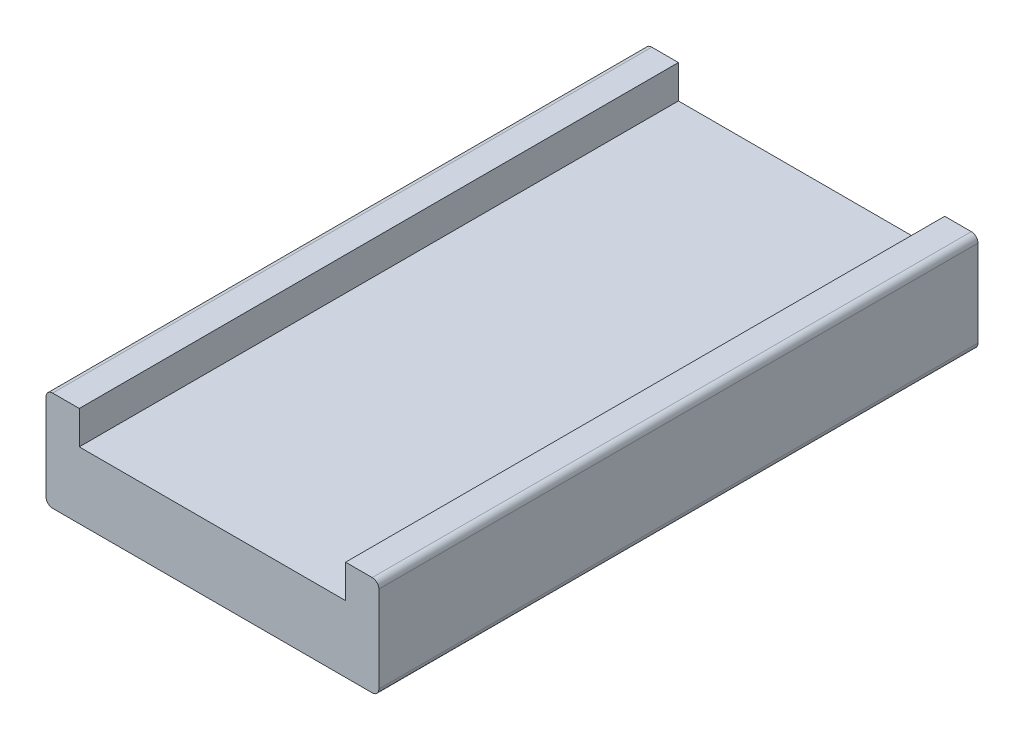
ISO-10303-21;
HEADER;
FILE_DESCRIPTION(('STEP AP214'),'2;1');
FILE_NAME('part.step','',(''),(''),'','','');
FILE_SCHEMA(('AUTOMOTIVE_DESIGN { 1 0 10303 214 1 1 1 1 }'));
ENDSEC;
DATA;
#1=APPLICATION_CONTEXT('core data for automotive mechanical design processes');
#2=APPLICATION_PROTOCOL_DEFINITION('international standard','automotive_design',2000,#1);
#3=PRODUCT_CONTEXT('',#1,'mechanical');
#4=PRODUCT('Part','Part','',(#3));
#5=PRODUCT_RELATED_PRODUCT_CATEGORY('part','',(#4));
#6=PRODUCT_DEFINITION_FORMATION('','',#4);
#7=PRODUCT_DEFINITION_CONTEXT('part definition',#1,'design');
#8=PRODUCT_DEFINITION('design','',#6,#7);
#9=PRODUCT_DEFINITION_SHAPE('','',#8);
#10=(LENGTH_UNIT() NAMED_UNIT(*) SI_UNIT(.MILLI.,.METRE.));
#11=(NAMED_UNIT(*) PLANE_ANGLE_UNIT() SI_UNIT($,.RADIAN.));
#12=(NAMED_UNIT(*) SI_UNIT($,.STERADIAN.) SOLID_ANGLE_UNIT());
#13=UNCERTAINTY_MEASURE_WITH_UNIT(LENGTH_MEASURE(1.E-05),#10,'distance_accuracy_value','');
#14=(GEOMETRIC_REPRESENTATION_CONTEXT(3) GLOBAL_UNCERTAINTY_ASSIGNED_CONTEXT((#13)) GLOBAL_UNIT_ASSIGNED_CONTEXT((#10,
#11,#12)) REPRESENTATION_CONTEXT('',''));
#15=CARTESIAN_POINT('',(0.,0.,0.));
#16=DIRECTION('',(0.,0.,1.));
#17=DIRECTION('',(1.,0.,0.));
#18=AXIS2_PLACEMENT_3D('',#15,#16,#17);
#19=CARTESIAN_POINT('',(-25.,15.,90.));
#20=DIRECTION('',(1.,0.,0.));
#21=DIRECTION('',(0.,1.,0.));
#22=AXIS2_PLACEMENT_3D('',#19,#20,#21);
#23=PLANE('',#22);
#24=DIRECTION('',(0.,-1.,0.));
#25=VECTOR('',#24,1.);
#26=CARTESIAN_POINT('',(-25.,15.,90.));
#27=LINE('',#26,#25);
#28=CARTESIAN_POINT('',(-25.,14.,90.));
#29=VERTEX_POINT('',#28);
#30=CARTESIAN_POINT('',(-25.,0.999999999999999,90.));
#31=VERTEX_POINT('',#30);
#32=EDGE_CURVE('E178',#29,#31,#27,.T.);
#33=ORIENTED_EDGE('',*,*,#32,.F.);
#34=DIRECTION('',(0.,0.,-1.));
#35=VECTOR('',#34,1.);
#36=CARTESIAN_POINT('',(-25.,14.,90.));
#37=LINE('',#36,#35);
#38=CARTESIAN_POINT('',(-25.,14.,0.));
#39=VERTEX_POINT('',#38);
#40=EDGE_CURVE('E208',#29,#39,#37,.T.);
#41=ORIENTED_EDGE('',*,*,#40,.T.);
#42=DIRECTION('',(0.,-1.,0.));
#43=VECTOR('',#42,1.);
#44=CARTESIAN_POINT('',(-25.,15.,0.));
#45=LINE('',#44,#43);
#46=CARTESIAN_POINT('',(-25.,0.999999999999999,0.));
#47=VERTEX_POINT('',#46);
#48=EDGE_CURVE('E161',#39,#47,#45,.T.);
#49=ORIENTED_EDGE('',*,*,#48,.T.);
#50=DIRECTION('',(0.,0.,-1.));
#51=VECTOR('',#50,1.);
#52=CARTESIAN_POINT('',(-25.,0.999999999999999,90.));
#53=LINE('',#52,#51);
#54=EDGE_CURVE('E206',#47,#31,#53,.F.);
#55=ORIENTED_EDGE('',*,*,#54,.T.);
#56=EDGE_LOOP('',(#33,#41,#49,#55));
#57=FACE_BOUND('',#56,.T.);
#58=ADVANCED_FACE('F33',(#57),#23,.F.);
#59=CARTESIAN_POINT('',(-25.,0.,90.));
#60=DIRECTION('',(0.,1.,0.));
#61=DIRECTION('',(-1.,0.,0.));
#62=AXIS2_PLACEMENT_3D('',#59,#60,#61);
#63=PLANE('',#62);
#64=DIRECTION('',(1.,0.,0.));
#65=VECTOR('',#64,1.);
#66=CARTESIAN_POINT('',(-25.,0.,90.));
#67=LINE('',#66,#65);
#68=CARTESIAN_POINT('',(-24.,0.,90.));
#69=VERTEX_POINT('',#68);
#70=CARTESIAN_POINT('',(24.,0.,90.));
#71=VERTEX_POINT('',#70);
#72=EDGE_CURVE('E228',#69,#71,#67,.T.);
#73=ORIENTED_EDGE('',*,*,#72,.F.);
#74=DIRECTION('',(0.,0.,-1.));
#75=VECTOR('',#74,1.);
#76=CARTESIAN_POINT('',(-24.,0.,90.));
#77=LINE('',#76,#75);
#78=CARTESIAN_POINT('',(-24.,0.,0.));
#79=VERTEX_POINT('',#78);
#80=EDGE_CURVE('E11',#69,#79,#77,.T.);
#81=ORIENTED_EDGE('',*,*,#80,.T.);
#82=DIRECTION('',(1.,0.,0.));
#83=VECTOR('',#82,1.);
#84=CARTESIAN_POINT('',(-25.,0.,0.));
#85=LINE('',#84,#83);
#86=CARTESIAN_POINT('',(24.,0.,0.));
#87=VERTEX_POINT('',#86);
#88=EDGE_CURVE('E164',#79,#87,#85,.T.);
#89=ORIENTED_EDGE('',*,*,#88,.T.);
#90=DIRECTION('',(0.,0.,-1.));
#91=VECTOR('',#90,1.);
#92=CARTESIAN_POINT('',(24.,0.,90.));
#93=LINE('',#92,#91);
#94=EDGE_CURVE('E41',#87,#71,#93,.F.);
#95=ORIENTED_EDGE('',*,*,#94,.T.);
#96=EDGE_LOOP('',(#73,#81,#89,#95));
#97=FACE_BOUND('',#96,.T.);
#98=ADVANCED_FACE('F227',(#97),#63,.F.);
#99=CARTESIAN_POINT('',(25.,0.,90.));
#100=DIRECTION('',(-1.,0.,0.));
#101=DIRECTION('',(0.,0.,1.));
#102=AXIS2_PLACEMENT_3D('',#99,#100,#101);
#103=PLANE('',#102);
#104=DIRECTION('',(0.,1.,0.));
#105=VECTOR('',#104,1.);
#106=CARTESIAN_POINT('',(25.,0.,0.));
#107=LINE('',#106,#105);
#108=CARTESIAN_POINT('',(25.,1.00000000000001,0.));
#109=VERTEX_POINT('',#108);
#110=CARTESIAN_POINT('',(25.,14.,0.));
#111=VERTEX_POINT('',#110);
#112=EDGE_CURVE('E166',#109,#111,#107,.T.);
#113=ORIENTED_EDGE('',*,*,#112,.T.);
#114=DIRECTION('',(0.,0.,-1.));
#115=VECTOR('',#114,1.);
#116=CARTESIAN_POINT('',(25.,14.,90.));
#117=LINE('',#116,#115);
#118=CARTESIAN_POINT('',(25.,14.,90.));
#119=VERTEX_POINT('',#118);
#120=EDGE_CURVE('E197',#111,#119,#117,.F.);
#121=ORIENTED_EDGE('',*,*,#120,.T.);
#122=DIRECTION('',(0.,1.,0.));
#123=VECTOR('',#122,1.);
#124=CARTESIAN_POINT('',(25.,0.,90.));
#125=LINE('',#124,#123);
#126=CARTESIAN_POINT('',(25.,1.00000000000001,90.));
#127=VERTEX_POINT('',#126);
#128=EDGE_CURVE('E136',#127,#119,#125,.T.);
#129=ORIENTED_EDGE('',*,*,#128,.F.);
#130=DIRECTION('',(0.,0.,-1.));
#131=VECTOR('',#130,1.);
#132=CARTESIAN_POINT('',(25.,1.00000000000001,90.));
#133=LINE('',#132,#131);
#134=EDGE_CURVE('E194',#127,#109,#133,.T.);
#135=ORIENTED_EDGE('',*,*,#134,.T.);
#136=EDGE_LOOP('',(#113,#121,#129,#135));
#137=FACE_BOUND('',#136,.T.);
#138=ADVANCED_FACE('F247',(#137),#103,.F.);
#139=CARTESIAN_POINT('',(25.,15.,90.));
#140=DIRECTION('',(0.,-1.,0.));
#141=DIRECTION('',(1.,0.,0.));
#142=AXIS2_PLACEMENT_3D('',#139,#140,#141);
#143=PLANE('',#142);
#144=DIRECTION('',(-1.,0.,0.));
#145=VECTOR('',#144,1.);
#146=CARTESIAN_POINT('',(25.,15.,90.));
#147=LINE('',#146,#145);
#148=CARTESIAN_POINT('',(24.,15.,90.));
#149=VERTEX_POINT('',#148);
#150=CARTESIAN_POINT('',(20.,15.,90.));
#151=VERTEX_POINT('',#150);
#152=EDGE_CURVE('E124',#149,#151,#147,.T.);
#153=ORIENTED_EDGE('',*,*,#152,.F.);
#154=DIRECTION('',(0.,0.,-1.));
#155=VECTOR('',#154,1.);
#156=CARTESIAN_POINT('',(24.,15.,90.));
#157=LINE('',#156,#155);
#158=CARTESIAN_POINT('',(24.,15.,0.));
#159=VERTEX_POINT('',#158);
#160=EDGE_CURVE('E145',#149,#159,#157,.T.);
#161=ORIENTED_EDGE('',*,*,#160,.T.);
#162=DIRECTION('',(-1.,0.,0.));
#163=VECTOR('',#162,1.);
#164=CARTESIAN_POINT('',(25.,15.,0.));
#165=LINE('',#164,#163);
#166=CARTESIAN_POINT('',(20.,15.,0.));
#167=VERTEX_POINT('',#166);
#168=EDGE_CURVE('E142',#159,#167,#165,.T.);
#169=ORIENTED_EDGE('',*,*,#168,.T.);
#170=DIRECTION('',(0.,0.,-1.));
#171=VECTOR('',#170,1.);
#172=CARTESIAN_POINT('',(20.,15.,90.));
#173=LINE('',#172,#171);
#174=EDGE_CURVE('E139',#151,#167,#173,.T.);
#175=ORIENTED_EDGE('',*,*,#174,.F.);
#176=EDGE_LOOP('',(#153,#161,#169,#175));
#177=FACE_BOUND('',#176,.T.);
#178=ADVANCED_FACE('F140',(#177),#143,.F.);
#179=CARTESIAN_POINT('',(20.,15.,90.));
#180=DIRECTION('',(1.,0.,0.));
#181=DIRECTION('',(0.,0.,-1.));
#182=AXIS2_PLACEMENT_3D('',#179,#180,#181);
#183=PLANE('',#182);
#184=DIRECTION('',(0.,-1.,0.));
#185=VECTOR('',#184,1.);
#186=CARTESIAN_POINT('',(20.,15.,0.));
#187=LINE('',#186,#185);
#188=CARTESIAN_POINT('',(20.,10.,0.));
#189=VERTEX_POINT('',#188);
#190=EDGE_CURVE('E170',#167,#189,#187,.T.);
#191=ORIENTED_EDGE('',*,*,#190,.T.);
#192=DIRECTION('',(0.,0.,-1.));
#193=VECTOR('',#192,1.);
#194=CARTESIAN_POINT('',(20.,10.,90.));
#195=LINE('',#194,#193);
#196=CARTESIAN_POINT('',(20.,10.,90.));
#197=VERTEX_POINT('',#196);
#198=EDGE_CURVE('E146',#197,#189,#195,.T.);
#199=ORIENTED_EDGE('',*,*,#198,.F.);
#200=DIRECTION('',(0.,-1.,0.));
#201=VECTOR('',#200,1.);
#202=CARTESIAN_POINT('',(20.,15.,90.));
#203=LINE('',#202,#201);
#204=EDGE_CURVE('E129',#151,#197,#203,.T.);
#205=ORIENTED_EDGE('',*,*,#204,.F.);
#206=ORIENTED_EDGE('',*,*,#174,.T.);
#207=EDGE_LOOP('',(#191,#199,#205,#206));
#208=FACE_BOUND('',#207,.T.);
#209=ADVANCED_FACE('F148',(#208),#183,.F.);
#210=CARTESIAN_POINT('',(20.,10.,90.));
#211=DIRECTION('',(0.,-1.,0.));
#212=DIRECTION('',(1.,0.,0.));
#213=AXIS2_PLACEMENT_3D('',#210,#211,#212);
#214=PLANE('',#213);
#215=DIRECTION('',(-1.,0.,0.));
#216=VECTOR('',#215,1.);
#217=CARTESIAN_POINT('',(20.,10.,0.));
#218=LINE('',#217,#216);
#219=CARTESIAN_POINT('',(-20.,10.,0.));
#220=VERTEX_POINT('',#219);
#221=EDGE_CURVE('E172',#189,#220,#218,.T.);
#222=ORIENTED_EDGE('',*,*,#221,.T.);
#223=DIRECTION('',(0.,0.,-1.));
#224=VECTOR('',#223,1.);
#225=CARTESIAN_POINT('',(-20.,10.,90.));
#226=LINE('',#225,#224);
#227=CARTESIAN_POINT('',(-20.,10.,90.));
#228=VERTEX_POINT('',#227);
#229=EDGE_CURVE('E181',#228,#220,#226,.T.);
#230=ORIENTED_EDGE('',*,*,#229,.F.);
#231=DIRECTION('',(-1.,0.,0.));
#232=VECTOR('',#231,1.);
#233=CARTESIAN_POINT('',(20.,10.,90.));
#234=LINE('',#233,#232);
#235=EDGE_CURVE('E151',#197,#228,#234,.T.);
#236=ORIENTED_EDGE('',*,*,#235,.F.);
#237=ORIENTED_EDGE('',*,*,#198,.T.);
#238=EDGE_LOOP('',(#222,#230,#236,#237));
#239=FACE_BOUND('',#238,.T.);
#240=ADVANCED_FACE('F257',(#239),#214,.F.);
#241=CARTESIAN_POINT('',(-20.,10.,90.));
#242=DIRECTION('',(-1.,0.,0.));
#243=DIRECTION('',(0.,-1.,0.));
#244=AXIS2_PLACEMENT_3D('',#241,#242,#243);
#245=PLANE('',#244);
#246=DIRECTION('',(0.,1.,0.));
#247=VECTOR('',#246,1.);
#248=CARTESIAN_POINT('',(-20.,10.,0.));
#249=LINE('',#248,#247);
#250=CARTESIAN_POINT('',(-20.,15.,0.));
#251=VERTEX_POINT('',#250);
#252=EDGE_CURVE('E174',#220,#251,#249,.T.);
#253=ORIENTED_EDGE('',*,*,#252,.T.);
#254=DIRECTION('',(0.,0.,-1.));
#255=VECTOR('',#254,1.);
#256=CARTESIAN_POINT('',(-20.,15.,90.));
#257=LINE('',#256,#255);
#258=CARTESIAN_POINT('',(-20.,15.,90.));
#259=VERTEX_POINT('',#258);
#260=EDGE_CURVE('E160',#259,#251,#257,.T.);
#261=ORIENTED_EDGE('',*,*,#260,.F.);
#262=DIRECTION('',(0.,1.,0.));
#263=VECTOR('',#262,1.);
#264=CARTESIAN_POINT('',(-20.,10.,90.));
#265=LINE('',#264,#263);
#266=EDGE_CURVE('E153',#228,#259,#265,.T.);
#267=ORIENTED_EDGE('',*,*,#266,.F.);
#268=ORIENTED_EDGE('',*,*,#229,.T.);
#269=EDGE_LOOP('',(#253,#261,#267,#268));
#270=FACE_BOUND('',#269,.T.);
#271=ADVANCED_FACE('F260',(#270),#245,.F.);
#272=CARTESIAN_POINT('',(-20.,15.,90.));
#273=DIRECTION('',(0.,-1.,0.));
#274=DIRECTION('',(1.,0.,0.));
#275=AXIS2_PLACEMENT_3D('',#272,#273,#274);
#276=PLANE('',#275);
#277=DIRECTION('',(-1.,0.,0.));
#278=VECTOR('',#277,1.);
#279=CARTESIAN_POINT('',(-20.,15.,0.));
#280=LINE('',#279,#278);
#281=CARTESIAN_POINT('',(-24.,15.,0.));
#282=VERTEX_POINT('',#281);
#283=EDGE_CURVE('E176',#251,#282,#280,.T.);
#284=ORIENTED_EDGE('',*,*,#283,.T.);
#285=DIRECTION('',(0.,0.,-1.));
#286=VECTOR('',#285,1.);
#287=CARTESIAN_POINT('',(-24.,15.,90.));
#288=LINE('',#287,#286);
#289=CARTESIAN_POINT('',(-24.,15.,90.));
#290=VERTEX_POINT('',#289);
#291=EDGE_CURVE('E48',#282,#290,#288,.F.);
#292=ORIENTED_EDGE('',*,*,#291,.T.);
#293=DIRECTION('',(-1.,0.,0.));
#294=VECTOR('',#293,1.);
#295=CARTESIAN_POINT('',(-20.,15.,90.));
#296=LINE('',#295,#294);
#297=EDGE_CURVE('E158',#259,#290,#296,.T.);
#298=ORIENTED_EDGE('',*,*,#297,.F.);
#299=ORIENTED_EDGE('',*,*,#260,.T.);
#300=EDGE_LOOP('',(#284,#292,#298,#299));
#301=FACE_BOUND('',#300,.T.);
#302=ADVANCED_FACE('F264',(#301),#276,.F.);
#303=CARTESIAN_POINT('',(0.,0.,90.));
#304=DIRECTION('',(0.,0.,1.));
#305=DIRECTION('',(1.,0.,0.));
#306=AXIS2_PLACEMENT_3D('',#303,#304,#305);
#307=PLANE('',#306);
#308=ORIENTED_EDGE('',*,*,#128,.T.);
#309=CARTESIAN_POINT('',(24.,14.,90.));
#310=DIRECTION('',(0.,0.,1.));
#311=DIRECTION('',(1.,0.,0.));
#312=AXIS2_PLACEMENT_3D('',#309,#310,#311);
#313=CIRCLE('',#312,1.);
#314=EDGE_CURVE('E132',#119,#149,#313,.T.);
#315=ORIENTED_EDGE('',*,*,#314,.T.);
#316=ORIENTED_EDGE('',*,*,#152,.T.);
#317=ORIENTED_EDGE('',*,*,#204,.T.);
#318=ORIENTED_EDGE('',*,*,#235,.T.);
#319=ORIENTED_EDGE('',*,*,#266,.T.);
#320=ORIENTED_EDGE('',*,*,#297,.T.);
#321=CARTESIAN_POINT('',(-24.,14.,90.));
#322=DIRECTION('',(0.,0.,1.));
#323=DIRECTION('',(1.,0.,0.));
#324=AXIS2_PLACEMENT_3D('',#321,#322,#323);
#325=CIRCLE('',#324,1.);
#326=EDGE_CURVE('E203',#290,#29,#325,.T.);
#327=ORIENTED_EDGE('',*,*,#326,.T.);
#328=ORIENTED_EDGE('',*,*,#32,.T.);
#329=CARTESIAN_POINT('',(-24.,1.,90.));
#330=DIRECTION('',(0.,0.,1.));
#331=DIRECTION('',(1.,0.,0.));
#332=AXIS2_PLACEMENT_3D('',#329,#330,#331);
#333=CIRCLE('',#332,1.);
#334=EDGE_CURVE('E201',#31,#69,#333,.T.);
#335=ORIENTED_EDGE('',*,*,#334,.T.);
#336=ORIENTED_EDGE('',*,*,#72,.T.);
#337=CARTESIAN_POINT('',(24.,1.00000000000001,90.));
#338=DIRECTION('',(0.,0.,1.));
#339=DIRECTION('',(1.,0.,0.));
#340=AXIS2_PLACEMENT_3D('',#337,#338,#339);
#341=CIRCLE('',#340,1.);
#342=EDGE_CURVE('E199',#71,#127,#341,.T.);
#343=ORIENTED_EDGE('',*,*,#342,.T.);
#344=EDGE_LOOP('',(#308,#315,#316,#317,#318,#319,#320,#327,#328,#335,#336,#343));
#345=FACE_BOUND('',#344,.T.);
#346=ADVANCED_FACE('F127',(#345),#307,.T.);
#347=CARTESIAN_POINT('',(0.,0.,0.));
#348=DIRECTION('',(0.,0.,1.));
#349=DIRECTION('',(1.,0.,0.));
#350=AXIS2_PLACEMENT_3D('',#347,#348,#349);
#351=PLANE('',#350);
#352=ORIENTED_EDGE('',*,*,#168,.F.);
#353=CARTESIAN_POINT('',(24.,14.,0.));
#354=DIRECTION('',(0.,0.,1.));
#355=DIRECTION('',(1.,0.,0.));
#356=AXIS2_PLACEMENT_3D('',#353,#354,#355);
#357=CIRCLE('',#356,1.);
#358=EDGE_CURVE('E192',#159,#111,#357,.F.);
#359=ORIENTED_EDGE('',*,*,#358,.T.);
#360=ORIENTED_EDGE('',*,*,#112,.F.);
#361=CARTESIAN_POINT('',(24.,1.00000000000001,0.));
#362=DIRECTION('',(0.,0.,1.));
#363=DIRECTION('',(1.,0.,0.));
#364=AXIS2_PLACEMENT_3D('',#361,#362,#363);
#365=CIRCLE('',#364,1.);
#366=EDGE_CURVE('E186',#109,#87,#365,.F.);
#367=ORIENTED_EDGE('',*,*,#366,.T.);
#368=ORIENTED_EDGE('',*,*,#88,.F.);
#369=CARTESIAN_POINT('',(-24.,1.,0.));
#370=DIRECTION('',(0.,0.,1.));
#371=DIRECTION('',(1.,0.,0.));
#372=AXIS2_PLACEMENT_3D('',#369,#370,#371);
#373=CIRCLE('',#372,1.);
#374=EDGE_CURVE('E188',#79,#47,#373,.F.);
#375=ORIENTED_EDGE('',*,*,#374,.T.);
#376=ORIENTED_EDGE('',*,*,#48,.F.);
#377=CARTESIAN_POINT('',(-24.,14.,0.));
#378=DIRECTION('',(0.,0.,1.));
#379=DIRECTION('',(1.,0.,0.));
#380=AXIS2_PLACEMENT_3D('',#377,#378,#379);
#381=CIRCLE('',#380,1.);
#382=EDGE_CURVE('E190',#39,#282,#381,.F.);
#383=ORIENTED_EDGE('',*,*,#382,.T.);
#384=ORIENTED_EDGE('',*,*,#283,.F.);
#385=ORIENTED_EDGE('',*,*,#252,.F.);
#386=ORIENTED_EDGE('',*,*,#221,.F.);
#387=ORIENTED_EDGE('',*,*,#190,.F.);
#388=EDGE_LOOP('',(#352,#359,#360,#367,#368,#375,#376,#383,#384,#385,#386,#387));
#389=FACE_BOUND('',#388,.T.);
#390=ADVANCED_FACE('F220',(#389),#351,.F.);
#391=CARTESIAN_POINT('',(24.,14.,90.));
#392=DIRECTION('',(0.,0.,-1.));
#393=DIRECTION('',(-1.,0.,0.));
#394=AXIS2_PLACEMENT_3D('',#391,#392,#393);
#395=CYLINDRICAL_SURFACE('',#394,1.);
#396=ORIENTED_EDGE('',*,*,#314,.F.);
#397=ORIENTED_EDGE('',*,*,#120,.F.);
#398=ORIENTED_EDGE('',*,*,#358,.F.);
#399=ORIENTED_EDGE('',*,*,#160,.F.);
#400=EDGE_LOOP('',(#396,#397,#398,#399));
#401=FACE_BOUND('',#400,.T.);
#402=ADVANCED_FACE('F234',(#401),#395,.T.);
#403=CARTESIAN_POINT('',(-24.,14.,90.));
#404=DIRECTION('',(0.,0.,-1.));
#405=DIRECTION('',(-1.,0.,0.));
#406=AXIS2_PLACEMENT_3D('',#403,#404,#405);
#407=CYLINDRICAL_SURFACE('',#406,1.);
#408=ORIENTED_EDGE('',*,*,#326,.F.);
#409=ORIENTED_EDGE('',*,*,#291,.F.);
#410=ORIENTED_EDGE('',*,*,#382,.F.);
#411=ORIENTED_EDGE('',*,*,#40,.F.);
#412=EDGE_LOOP('',(#408,#409,#410,#411));
#413=FACE_BOUND('',#412,.T.);
#414=ADVANCED_FACE('F232',(#413),#407,.T.);
#415=CARTESIAN_POINT('',(-24.,1.,90.));
#416=DIRECTION('',(0.,0.,-1.));
#417=DIRECTION('',(-1.,0.,0.));
#418=AXIS2_PLACEMENT_3D('',#415,#416,#417);
#419=CYLINDRICAL_SURFACE('',#418,1.);
#420=ORIENTED_EDGE('',*,*,#334,.F.);
#421=ORIENTED_EDGE('',*,*,#54,.F.);
#422=ORIENTED_EDGE('',*,*,#374,.F.);
#423=ORIENTED_EDGE('',*,*,#80,.F.);
#424=EDGE_LOOP('',(#420,#421,#422,#423));
#425=FACE_BOUND('',#424,.T.);
#426=ADVANCED_FACE('F226',(#425),#419,.T.);
#427=CARTESIAN_POINT('',(24.,1.00000000000001,90.));
#428=DIRECTION('',(0.,0.,-1.));
#429=DIRECTION('',(-1.,0.,0.));
#430=AXIS2_PLACEMENT_3D('',#427,#428,#429);
#431=CYLINDRICAL_SURFACE('',#430,1.);
#432=ORIENTED_EDGE('',*,*,#342,.F.);
#433=ORIENTED_EDGE('',*,*,#94,.F.);
#434=ORIENTED_EDGE('',*,*,#366,.F.);
#435=ORIENTED_EDGE('',*,*,#134,.F.);
#436=EDGE_LOOP('',(#432,#433,#434,#435));
#437=FACE_BOUND('',#436,.T.);
#438=ADVANCED_FACE('F35',(#437),#431,.T.);
#439=CLOSED_SHELL('',(#58,#98,#138,#178,#209,#240,#271,#302,#346,#390,#402,#414,#426,#438));
#440=MANIFOLD_SOLID_BREP('B2',#439);
#441=ADVANCED_BREP_SHAPE_REPRESENTATION('',(#18,#440),#14);
#442=SHAPE_DEFINITION_REPRESENTATION(#9,#441);
ENDSEC;
END-ISO-10303-21;
